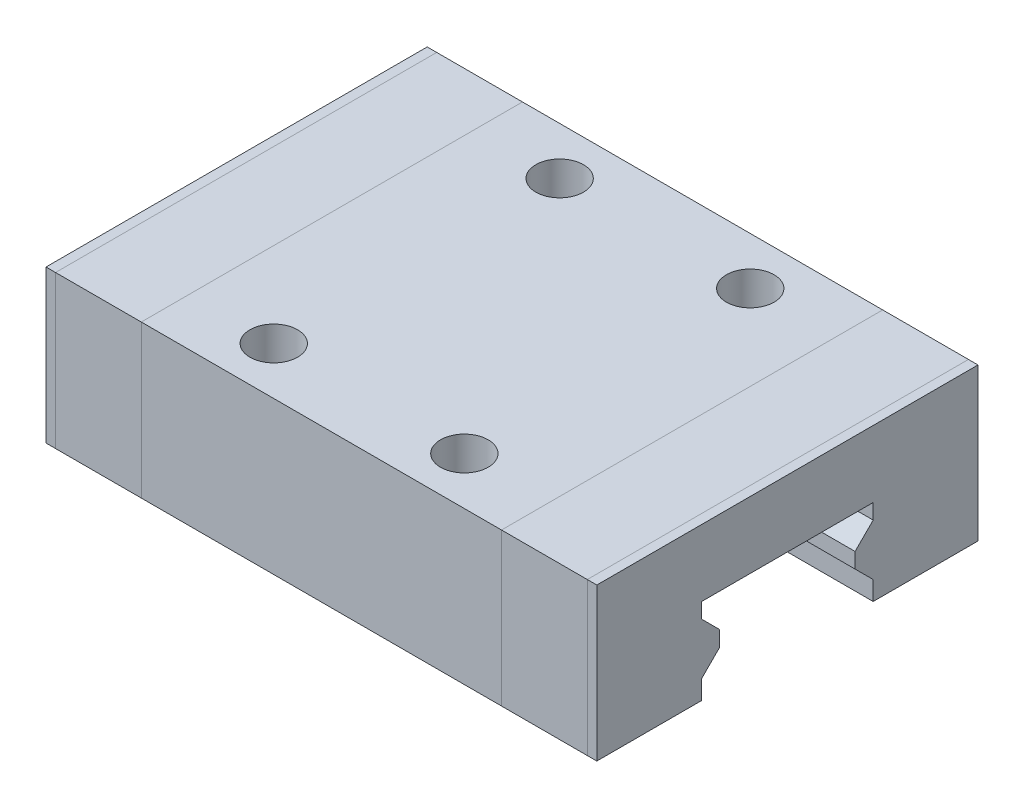
ISO-10303-21;
HEADER;
FILE_DESCRIPTION(('STEP AP214'),'2;1');
FILE_NAME('part.step','',(''),(''),'','','');
FILE_SCHEMA(('AUTOMOTIVE_DESIGN { 1 0 10303 214 1 1 1 1 }'));
ENDSEC;
DATA;
#1=APPLICATION_CONTEXT('core data for automotive mechanical design processes');
#2=APPLICATION_PROTOCOL_DEFINITION('international standard','automotive_design',2000,#1);
#3=PRODUCT_CONTEXT('',#1,'mechanical');
#4=PRODUCT('Part','Part','',(#3));
#5=PRODUCT_RELATED_PRODUCT_CATEGORY('part','',(#4));
#6=PRODUCT_DEFINITION_FORMATION('','',#4);
#7=PRODUCT_DEFINITION_CONTEXT('part definition',#1,'design');
#8=PRODUCT_DEFINITION('design','',#6,#7);
#9=PRODUCT_DEFINITION_SHAPE('','',#8);
#10=(LENGTH_UNIT() NAMED_UNIT(*) SI_UNIT(.MILLI.,.METRE.));
#11=(NAMED_UNIT(*) PLANE_ANGLE_UNIT() SI_UNIT($,.RADIAN.));
#12=(NAMED_UNIT(*) SI_UNIT($,.STERADIAN.) SOLID_ANGLE_UNIT());
#13=UNCERTAINTY_MEASURE_WITH_UNIT(LENGTH_MEASURE(1.E-05),#10,'distance_accuracy_value','');
#14=(GEOMETRIC_REPRESENTATION_CONTEXT(3) GLOBAL_UNCERTAINTY_ASSIGNED_CONTEXT((#13)) GLOBAL_UNIT_ASSIGNED_CONTEXT((#10,
#11,#12)) REPRESENTATION_CONTEXT('',''));
#15=CARTESIAN_POINT('',(0.,0.,0.));
#16=DIRECTION('',(0.,0.,1.));
#17=DIRECTION('',(1.,0.,0.));
#18=AXIS2_PLACEMENT_3D('',#15,#16,#17);
#19=CARTESIAN_POINT('',(0.,0.,0.));
#20=DIRECTION('',(0.,1.,0.));
#21=DIRECTION('',(0.,0.,1.));
#22=AXIS2_PLACEMENT_3D('',#19,#20,#21);
#23=PLANE('',#22);
#24=DIRECTION('',(0.,0.,-1.));
#25=VECTOR('',#24,1.);
#26=CARTESIAN_POINT('',(13.95,0.,0.));
#27=LINE('',#26,#25);
#28=CARTESIAN_POINT('',(13.95,0.,-4.5));
#29=VERTEX_POINT('',#28);
#30=CARTESIAN_POINT('',(13.95,0.,-10.));
#31=VERTEX_POINT('',#30);
#32=EDGE_CURVE('E453',#29,#31,#27,.T.);
#33=ORIENTED_EDGE('',*,*,#32,.F.);
#34=DIRECTION('',(-1.,0.,0.));
#35=VECTOR('',#34,1.);
#36=CARTESIAN_POINT('',(14.45,0.,-4.5));
#37=LINE('',#36,#35);
#38=CARTESIAN_POINT('',(9.45,0.,-4.5));
#39=VERTEX_POINT('',#38);
#40=EDGE_CURVE('E339',#29,#39,#37,.T.);
#41=ORIENTED_EDGE('',*,*,#40,.T.);
#42=DIRECTION('',(0.,0.,1.));
#43=VECTOR('',#42,1.);
#44=CARTESIAN_POINT('',(9.45,0.,0.));
#45=LINE('',#44,#43);
#46=CARTESIAN_POINT('',(9.45,0.,-10.));
#47=VERTEX_POINT('',#46);
#48=EDGE_CURVE('E441',#47,#39,#45,.T.);
#49=ORIENTED_EDGE('',*,*,#48,.F.);
#50=DIRECTION('',(-1.,0.,0.));
#51=VECTOR('',#50,1.);
#52=CARTESIAN_POINT('',(14.45,0.,-10.));
#53=LINE('',#52,#51);
#54=EDGE_CURVE('E398',#31,#47,#53,.T.);
#55=ORIENTED_EDGE('',*,*,#54,.F.);
#56=EDGE_LOOP('',(#33,#41,#49,#55));
#57=FACE_BOUND('',#56,.T.);
#58=ADVANCED_FACE('F40',(#57),#23,.F.);
#59=DIRECTION('',(0.,0.,-1.));
#60=VECTOR('',#59,1.);
#61=CARTESIAN_POINT('',(-13.95,0.,0.));
#62=LINE('',#61,#60);
#63=CARTESIAN_POINT('',(-13.95,0.,-4.5));
#64=VERTEX_POINT('',#63);
#65=CARTESIAN_POINT('',(-13.95,0.,-10.));
#66=VERTEX_POINT('',#65);
#67=EDGE_CURVE('E449',#64,#66,#62,.T.);
#68=ORIENTED_EDGE('',*,*,#67,.F.);
#69=CARTESIAN_POINT('',(-14.45,0.,-4.5));
#70=VERTEX_POINT('',#69);
#71=EDGE_CURVE('E340',#64,#70,#37,.T.);
#72=ORIENTED_EDGE('',*,*,#71,.T.);
#73=DIRECTION('',(0.,0.,1.));
#74=VECTOR('',#73,1.);
#75=CARTESIAN_POINT('',(-14.45,0.,10.));
#76=LINE('',#75,#74);
#77=CARTESIAN_POINT('',(-14.45,0.,-10.));
#78=VERTEX_POINT('',#77);
#79=EDGE_CURVE('E382',#78,#70,#76,.T.);
#80=ORIENTED_EDGE('',*,*,#79,.F.);
#81=EDGE_CURVE('E395',#66,#78,#53,.T.);
#82=ORIENTED_EDGE('',*,*,#81,.F.);
#83=EDGE_LOOP('',(#68,#72,#80,#82));
#84=FACE_BOUND('',#83,.T.);
#85=ADVANCED_FACE('F535',(#84),#23,.F.);
#86=DIRECTION('',(0.,0.,-1.));
#87=VECTOR('',#86,1.);
#88=CARTESIAN_POINT('',(14.45,0.,10.));
#89=LINE('',#88,#87);
#90=CARTESIAN_POINT('',(14.45,0.,-4.5));
#91=VERTEX_POINT('',#90);
#92=CARTESIAN_POINT('',(14.45,0.,-10.));
#93=VERTEX_POINT('',#92);
#94=EDGE_CURVE('E389',#91,#93,#89,.T.);
#95=ORIENTED_EDGE('',*,*,#94,.F.);
#96=EDGE_CURVE('E335',#91,#29,#37,.T.);
#97=ORIENTED_EDGE('',*,*,#96,.T.);
#98=ORIENTED_EDGE('',*,*,#32,.T.);
#99=EDGE_CURVE('E367',#93,#31,#53,.T.);
#100=ORIENTED_EDGE('',*,*,#99,.F.);
#101=EDGE_LOOP('',(#95,#97,#98,#100));
#102=FACE_BOUND('',#101,.T.);
#103=ADVANCED_FACE('F505',(#102),#23,.F.);
#104=DIRECTION('',(0.,0.,-1.));
#105=VECTOR('',#104,1.);
#106=CARTESIAN_POINT('',(-9.45,0.,0.));
#107=LINE('',#106,#105);
#108=CARTESIAN_POINT('',(-9.45,0.,-4.5));
#109=VERTEX_POINT('',#108);
#110=CARTESIAN_POINT('',(-9.45,0.,-10.));
#111=VERTEX_POINT('',#110);
#112=EDGE_CURVE('E416',#109,#111,#107,.T.);
#113=ORIENTED_EDGE('',*,*,#112,.F.);
#114=EDGE_CURVE('E527',#109,#64,#37,.T.);
#115=ORIENTED_EDGE('',*,*,#114,.T.);
#116=ORIENTED_EDGE('',*,*,#67,.T.);
#117=EDGE_CURVE('E399',#111,#66,#53,.T.);
#118=ORIENTED_EDGE('',*,*,#117,.F.);
#119=EDGE_LOOP('',(#113,#115,#116,#118));
#120=FACE_BOUND('',#119,.T.);
#121=ADVANCED_FACE('F559',(#120),#23,.F.);
#122=ORIENTED_EDGE('',*,*,#48,.T.);
#123=DIRECTION('',(-1.,0.,0.));
#124=VECTOR('',#123,1.);
#125=CARTESIAN_POINT('',(0.,0.,-4.5));
#126=LINE('',#125,#124);
#127=EDGE_CURVE('E11',#39,#109,#126,.T.);
#128=ORIENTED_EDGE('',*,*,#127,.T.);
#129=ORIENTED_EDGE('',*,*,#112,.T.);
#130=EDGE_CURVE('E517',#47,#111,#53,.T.);
#131=ORIENTED_EDGE('',*,*,#130,.F.);
#132=EDGE_LOOP('',(#122,#128,#129,#131));
#133=FACE_BOUND('',#132,.T.);
#134=ADVANCED_FACE('F560',(#133),#23,.F.);
#135=CARTESIAN_POINT('',(14.45,8.,10.));
#136=DIRECTION('',(0.,0.,-1.));
#137=DIRECTION('',(-1.,0.,0.));
#138=AXIS2_PLACEMENT_3D('',#135,#136,#137);
#139=PLANE('',#138);
#140=DIRECTION('',(0.,-1.,0.));
#141=VECTOR('',#140,1.);
#142=CARTESIAN_POINT('',(13.95,8.,10.));
#143=LINE('',#142,#141);
#144=CARTESIAN_POINT('',(13.95,8.,10.));
#145=VERTEX_POINT('',#144);
#146=CARTESIAN_POINT('',(13.95,0.,10.));
#147=VERTEX_POINT('',#146);
#148=EDGE_CURVE('E63',#145,#147,#143,.T.);
#149=ORIENTED_EDGE('',*,*,#148,.F.);
#150=DIRECTION('',(1.,0.,0.));
#151=VECTOR('',#150,1.);
#152=CARTESIAN_POINT('',(14.45,8.,10.));
#153=LINE('',#152,#151);
#154=CARTESIAN_POINT('',(9.45,8.,10.));
#155=VERTEX_POINT('',#154);
#156=EDGE_CURVE('E639',#155,#145,#153,.T.);
#157=ORIENTED_EDGE('',*,*,#156,.F.);
#158=DIRECTION('',(0.,1.,0.));
#159=VECTOR('',#158,1.);
#160=CARTESIAN_POINT('',(9.45,8.,10.));
#161=LINE('',#160,#159);
#162=CARTESIAN_POINT('',(9.45,0.,10.));
#163=VERTEX_POINT('',#162);
#164=EDGE_CURVE('E433',#163,#155,#161,.T.);
#165=ORIENTED_EDGE('',*,*,#164,.F.);
#166=DIRECTION('',(1.,0.,0.));
#167=VECTOR('',#166,1.);
#168=CARTESIAN_POINT('',(14.45,0.,10.));
#169=LINE('',#168,#167);
#170=EDGE_CURVE('E484',#163,#147,#169,.T.);
#171=ORIENTED_EDGE('',*,*,#170,.T.);
#172=EDGE_LOOP('',(#149,#157,#165,#171));
#173=FACE_BOUND('',#172,.T.);
#174=ADVANCED_FACE('F562',(#173),#139,.F.);
#175=CARTESIAN_POINT('',(14.45,8.,-10.));
#176=DIRECTION('',(0.,0.,1.));
#177=DIRECTION('',(1.,0.,0.));
#178=AXIS2_PLACEMENT_3D('',#175,#176,#177);
#179=PLANE('',#178);
#180=DIRECTION('',(0.,1.,0.));
#181=VECTOR('',#180,1.);
#182=CARTESIAN_POINT('',(13.95,8.,-10.));
#183=LINE('',#182,#181);
#184=CARTESIAN_POINT('',(13.95,8.,-10.));
#185=VERTEX_POINT('',#184);
#186=EDGE_CURVE('E461',#31,#185,#183,.T.);
#187=ORIENTED_EDGE('',*,*,#186,.F.);
#188=ORIENTED_EDGE('',*,*,#54,.T.);
#189=DIRECTION('',(0.,-1.,0.));
#190=VECTOR('',#189,1.);
#191=CARTESIAN_POINT('',(9.45,8.,-10.));
#192=LINE('',#191,#190);
#193=CARTESIAN_POINT('',(9.45,8.,-10.));
#194=VERTEX_POINT('',#193);
#195=EDGE_CURVE('E429',#194,#47,#192,.T.);
#196=ORIENTED_EDGE('',*,*,#195,.F.);
#197=DIRECTION('',(-1.,0.,0.));
#198=VECTOR('',#197,1.);
#199=CARTESIAN_POINT('',(14.45,8.,-10.));
#200=LINE('',#199,#198);
#201=EDGE_CURVE('E380',#185,#194,#200,.T.);
#202=ORIENTED_EDGE('',*,*,#201,.F.);
#203=EDGE_LOOP('',(#187,#188,#196,#202));
#204=FACE_BOUND('',#203,.T.);
#205=ADVANCED_FACE('F511',(#204),#179,.F.);
#206=CARTESIAN_POINT('',(0.,8.,0.));
#207=DIRECTION('',(0.,1.,0.));
#208=DIRECTION('',(0.,0.,1.));
#209=AXIS2_PLACEMENT_3D('',#206,#207,#208);
#210=PLANE('',#209);
#211=ORIENTED_EDGE('',*,*,#156,.T.);
#212=DIRECTION('',(0.,0.,-1.));
#213=VECTOR('',#212,1.);
#214=CARTESIAN_POINT('',(13.95,8.,0.));
#215=LINE('',#214,#213);
#216=EDGE_CURVE('E464',#145,#185,#215,.T.);
#217=ORIENTED_EDGE('',*,*,#216,.T.);
#218=ORIENTED_EDGE('',*,*,#201,.T.);
#219=DIRECTION('',(0.,0.,1.));
#220=VECTOR('',#219,1.);
#221=CARTESIAN_POINT('',(9.45,8.,0.));
#222=LINE('',#221,#220);
#223=EDGE_CURVE('E434',#194,#155,#222,.T.);
#224=ORIENTED_EDGE('',*,*,#223,.T.);
#225=EDGE_LOOP('',(#211,#217,#218,#224));
#226=FACE_BOUND('',#225,.T.);
#227=ADVANCED_FACE('F573',(#226),#210,.T.);
#228=CARTESIAN_POINT('',(9.45,0.,4.5));
#229=VERTEX_POINT('',#228);
#230=EDGE_CURVE('E421',#229,#163,#45,.T.);
#231=ORIENTED_EDGE('',*,*,#230,.F.);
#232=DIRECTION('',(-1.,0.,0.));
#233=VECTOR('',#232,1.);
#234=CARTESIAN_POINT('',(14.45,0.,4.5));
#235=LINE('',#234,#233);
#236=CARTESIAN_POINT('',(13.95,0.,4.5));
#237=VERTEX_POINT('',#236);
#238=EDGE_CURVE('E55',#237,#229,#235,.T.);
#239=ORIENTED_EDGE('',*,*,#238,.F.);
#240=EDGE_CURVE('E470',#147,#237,#27,.T.);
#241=ORIENTED_EDGE('',*,*,#240,.F.);
#242=ORIENTED_EDGE('',*,*,#170,.F.);
#243=EDGE_LOOP('',(#231,#239,#241,#242));
#244=FACE_BOUND('',#243,.T.);
#245=ADVANCED_FACE('F482',(#244),#23,.F.);
#246=DIRECTION('',(0.,1.,0.));
#247=VECTOR('',#246,1.);
#248=CARTESIAN_POINT('',(-13.95,8.,-10.));
#249=LINE('',#248,#247);
#250=CARTESIAN_POINT('',(-13.95,8.,-10.));
#251=VERTEX_POINT('',#250);
#252=EDGE_CURVE('E450',#66,#251,#249,.T.);
#253=ORIENTED_EDGE('',*,*,#252,.F.);
#254=ORIENTED_EDGE('',*,*,#81,.T.);
#255=DIRECTION('',(0.,-1.,0.));
#256=VECTOR('',#255,1.);
#257=CARTESIAN_POINT('',(-14.45,8.,-10.));
#258=LINE('',#257,#256);
#259=CARTESIAN_POINT('',(-14.45,8.,-10.));
#260=VERTEX_POINT('',#259);
#261=EDGE_CURVE('E379',#260,#78,#258,.T.);
#262=ORIENTED_EDGE('',*,*,#261,.F.);
#263=EDGE_CURVE('E375',#251,#260,#200,.T.);
#264=ORIENTED_EDGE('',*,*,#263,.F.);
#265=EDGE_LOOP('',(#253,#254,#262,#264));
#266=FACE_BOUND('',#265,.T.);
#267=ADVANCED_FACE('F546',(#266),#179,.F.);
#268=CARTESIAN_POINT('',(-14.45,0.,4.5));
#269=VERTEX_POINT('',#268);
#270=CARTESIAN_POINT('',(-14.45,0.,10.));
#271=VERTEX_POINT('',#270);
#272=EDGE_CURVE('E338',#269,#271,#76,.T.);
#273=ORIENTED_EDGE('',*,*,#272,.F.);
#274=CARTESIAN_POINT('',(-13.95,0.,4.5));
#275=VERTEX_POINT('',#274);
#276=EDGE_CURVE('E304',#275,#269,#235,.T.);
#277=ORIENTED_EDGE('',*,*,#276,.F.);
#278=CARTESIAN_POINT('',(-13.95,0.,10.));
#279=VERTEX_POINT('',#278);
#280=EDGE_CURVE('E454',#279,#275,#62,.T.);
#281=ORIENTED_EDGE('',*,*,#280,.F.);
#282=EDGE_CURVE('E386',#271,#279,#169,.T.);
#283=ORIENTED_EDGE('',*,*,#282,.F.);
#284=EDGE_LOOP('',(#273,#277,#281,#283));
#285=FACE_BOUND('',#284,.T.);
#286=ADVANCED_FACE('F574',(#285),#23,.F.);
#287=DIRECTION('',(0.,-1.,0.));
#288=VECTOR('',#287,1.);
#289=CARTESIAN_POINT('',(-13.95,8.,10.));
#290=LINE('',#289,#288);
#291=CARTESIAN_POINT('',(-13.95,8.,10.));
#292=VERTEX_POINT('',#291);
#293=EDGE_CURVE('E445',#292,#279,#290,.T.);
#294=ORIENTED_EDGE('',*,*,#293,.F.);
#295=CARTESIAN_POINT('',(-14.45,8.,10.));
#296=VERTEX_POINT('',#295);
#297=EDGE_CURVE('E368',#296,#292,#153,.T.);
#298=ORIENTED_EDGE('',*,*,#297,.F.);
#299=DIRECTION('',(0.,-1.,0.));
#300=VECTOR('',#299,1.);
#301=CARTESIAN_POINT('',(-14.45,8.,10.));
#302=LINE('',#301,#300);
#303=EDGE_CURVE('E408',#296,#271,#302,.T.);
#304=ORIENTED_EDGE('',*,*,#303,.T.);
#305=ORIENTED_EDGE('',*,*,#282,.T.);
#306=EDGE_LOOP('',(#294,#298,#304,#305));
#307=FACE_BOUND('',#306,.T.);
#308=ADVANCED_FACE('F568',(#307),#139,.F.);
#309=ORIENTED_EDGE('',*,*,#297,.T.);
#310=DIRECTION('',(0.,0.,-1.));
#311=VECTOR('',#310,1.);
#312=CARTESIAN_POINT('',(-13.95,8.,0.));
#313=LINE('',#312,#311);
#314=EDGE_CURVE('E437',#292,#251,#313,.T.);
#315=ORIENTED_EDGE('',*,*,#314,.T.);
#316=ORIENTED_EDGE('',*,*,#263,.T.);
#317=DIRECTION('',(0.,0.,1.));
#318=VECTOR('',#317,1.);
#319=CARTESIAN_POINT('',(-14.45,8.,10.));
#320=LINE('',#319,#318);
#321=EDGE_CURVE('E363',#260,#296,#320,.T.);
#322=ORIENTED_EDGE('',*,*,#321,.T.);
#323=EDGE_LOOP('',(#309,#315,#316,#322));
#324=FACE_BOUND('',#323,.T.);
#325=ADVANCED_FACE('F607',(#324),#210,.T.);
#326=CARTESIAN_POINT('',(14.45,8.,10.));
#327=VERTEX_POINT('',#326);
#328=EDGE_CURVE('E366',#145,#327,#153,.T.);
#329=ORIENTED_EDGE('',*,*,#328,.F.);
#330=ORIENTED_EDGE('',*,*,#148,.T.);
#331=CARTESIAN_POINT('',(14.45,0.,10.));
#332=VERTEX_POINT('',#331);
#333=EDGE_CURVE('E385',#147,#332,#169,.T.);
#334=ORIENTED_EDGE('',*,*,#333,.T.);
#335=DIRECTION('',(0.,-1.,0.));
#336=VECTOR('',#335,1.);
#337=CARTESIAN_POINT('',(14.45,8.,10.));
#338=LINE('',#337,#336);
#339=EDGE_CURVE('E405',#327,#332,#338,.T.);
#340=ORIENTED_EDGE('',*,*,#339,.F.);
#341=EDGE_LOOP('',(#329,#330,#334,#340));
#342=FACE_BOUND('',#341,.T.);
#343=ADVANCED_FACE('F599',(#342),#139,.F.);
#344=ORIENTED_EDGE('',*,*,#99,.T.);
#345=ORIENTED_EDGE('',*,*,#186,.T.);
#346=CARTESIAN_POINT('',(14.45,8.,-10.));
#347=VERTEX_POINT('',#346);
#348=EDGE_CURVE('E376',#347,#185,#200,.T.);
#349=ORIENTED_EDGE('',*,*,#348,.F.);
#350=DIRECTION('',(0.,-1.,0.));
#351=VECTOR('',#350,1.);
#352=CARTESIAN_POINT('',(14.45,8.,-10.));
#353=LINE('',#352,#351);
#354=EDGE_CURVE('E402',#347,#93,#353,.T.);
#355=ORIENTED_EDGE('',*,*,#354,.T.);
#356=EDGE_LOOP('',(#344,#345,#349,#355));
#357=FACE_BOUND('',#356,.T.);
#358=ADVANCED_FACE('F518',(#357),#179,.F.);
#359=ORIENTED_EDGE('',*,*,#216,.F.);
#360=ORIENTED_EDGE('',*,*,#328,.T.);
#361=DIRECTION('',(0.,0.,-1.));
#362=VECTOR('',#361,1.);
#363=CARTESIAN_POINT('',(14.45,8.,10.));
#364=LINE('',#363,#362);
#365=EDGE_CURVE('E371',#327,#347,#364,.T.);
#366=ORIENTED_EDGE('',*,*,#365,.T.);
#367=ORIENTED_EDGE('',*,*,#348,.T.);
#368=EDGE_LOOP('',(#359,#360,#366,#367));
#369=FACE_BOUND('',#368,.T.);
#370=ADVANCED_FACE('F601',(#369),#210,.T.);
#371=ORIENTED_EDGE('',*,*,#240,.T.);
#372=CARTESIAN_POINT('',(14.45,0.,4.5));
#373=VERTEX_POINT('',#372);
#374=EDGE_CURVE('E361',#373,#237,#235,.T.);
#375=ORIENTED_EDGE('',*,*,#374,.F.);
#376=EDGE_CURVE('E392',#332,#373,#89,.T.);
#377=ORIENTED_EDGE('',*,*,#376,.F.);
#378=ORIENTED_EDGE('',*,*,#333,.F.);
#379=EDGE_LOOP('',(#371,#375,#377,#378));
#380=FACE_BOUND('',#379,.T.);
#381=ADVANCED_FACE('F593',(#380),#23,.F.);
#382=ORIENTED_EDGE('',*,*,#117,.T.);
#383=ORIENTED_EDGE('',*,*,#252,.T.);
#384=CARTESIAN_POINT('',(-9.45,8.,-10.));
#385=VERTEX_POINT('',#384);
#386=EDGE_CURVE('E381',#385,#251,#200,.T.);
#387=ORIENTED_EDGE('',*,*,#386,.F.);
#388=DIRECTION('',(0.,1.,0.));
#389=VECTOR('',#388,1.);
#390=CARTESIAN_POINT('',(-9.45,8.,-10.));
#391=LINE('',#390,#389);
#392=EDGE_CURVE('E417',#111,#385,#391,.T.);
#393=ORIENTED_EDGE('',*,*,#392,.F.);
#394=EDGE_LOOP('',(#382,#383,#387,#393));
#395=FACE_BOUND('',#394,.T.);
#396=ADVANCED_FACE('F558',(#395),#179,.F.);
#397=ORIENTED_EDGE('',*,*,#280,.T.);
#398=CARTESIAN_POINT('',(-9.45,0.,4.5));
#399=VERTEX_POINT('',#398);
#400=EDGE_CURVE('E623',#399,#275,#235,.T.);
#401=ORIENTED_EDGE('',*,*,#400,.F.);
#402=CARTESIAN_POINT('',(-9.45,0.,10.));
#403=VERTEX_POINT('',#402);
#404=EDGE_CURVE('E422',#403,#399,#107,.T.);
#405=ORIENTED_EDGE('',*,*,#404,.F.);
#406=EDGE_CURVE('E390',#279,#403,#169,.T.);
#407=ORIENTED_EDGE('',*,*,#406,.F.);
#408=EDGE_LOOP('',(#397,#401,#405,#407));
#409=FACE_BOUND('',#408,.T.);
#410=ADVANCED_FACE('F581',(#409),#23,.F.);
#411=CARTESIAN_POINT('',(-9.45,8.,10.));
#412=VERTEX_POINT('',#411);
#413=EDGE_CURVE('E372',#292,#412,#153,.T.);
#414=ORIENTED_EDGE('',*,*,#413,.F.);
#415=ORIENTED_EDGE('',*,*,#293,.T.);
#416=ORIENTED_EDGE('',*,*,#406,.T.);
#417=DIRECTION('',(0.,-1.,0.));
#418=VECTOR('',#417,1.);
#419=CARTESIAN_POINT('',(-9.45,8.,10.));
#420=LINE('',#419,#418);
#421=EDGE_CURVE('E412',#412,#403,#420,.T.);
#422=ORIENTED_EDGE('',*,*,#421,.F.);
#423=EDGE_LOOP('',(#414,#415,#416,#422));
#424=FACE_BOUND('',#423,.T.);
#425=ADVANCED_FACE('F591',(#424),#139,.F.);
#426=ORIENTED_EDGE('',*,*,#314,.F.);
#427=ORIENTED_EDGE('',*,*,#413,.T.);
#428=DIRECTION('',(0.,0.,-1.));
#429=VECTOR('',#428,1.);
#430=CARTESIAN_POINT('',(-9.45,8.,0.));
#431=LINE('',#430,#429);
#432=EDGE_CURVE('E411',#412,#385,#431,.T.);
#433=ORIENTED_EDGE('',*,*,#432,.T.);
#434=ORIENTED_EDGE('',*,*,#386,.T.);
#435=EDGE_LOOP('',(#426,#427,#433,#434));
#436=FACE_BOUND('',#435,.T.);
#437=ADVANCED_FACE('F589',(#436),#210,.T.);
#438=CARTESIAN_POINT('',(-14.45,8.,10.));
#439=DIRECTION('',(1.,0.,0.));
#440=DIRECTION('',(0.,0.,-1.));
#441=AXIS2_PLACEMENT_3D('',#438,#439,#440);
#442=PLANE('',#441);
#443=ORIENTED_EDGE('',*,*,#79,.T.);
#444=DIRECTION('',(0.,-1.,0.));
#445=VECTOR('',#444,1.);
#446=CARTESIAN_POINT('',(-14.45,0.,-4.5));
#447=LINE('',#446,#445);
#448=CARTESIAN_POINT('',(-14.45,1.,-4.5));
#449=VERTEX_POINT('',#448);
#450=EDGE_CURVE('E274',#449,#70,#447,.T.);
#451=ORIENTED_EDGE('',*,*,#450,.F.);
#452=DIRECTION('',(0.,-0.707106781186547,-0.707106781186548));
#453=VECTOR('',#452,1.);
#454=CARTESIAN_POINT('',(-14.45,1.,-4.5));
#455=LINE('',#454,#453);
#456=CARTESIAN_POINT('',(-14.45,1.95,-3.55));
#457=VERTEX_POINT('',#456);
#458=EDGE_CURVE('E331',#457,#449,#455,.T.);
#459=ORIENTED_EDGE('',*,*,#458,.F.);
#460=DIRECTION('',(0.,-1.,0.));
#461=VECTOR('',#460,1.);
#462=CARTESIAN_POINT('',(-14.45,2.75,-3.55));
#463=LINE('',#462,#461);
#464=CARTESIAN_POINT('',(-14.45,2.75,-3.55));
#465=VERTEX_POINT('',#464);
#466=EDGE_CURVE('E328',#465,#457,#463,.T.);
#467=ORIENTED_EDGE('',*,*,#466,.F.);
#468=DIRECTION('',(0.,-0.707106781186547,0.707106781186547));
#469=VECTOR('',#468,1.);
#470=CARTESIAN_POINT('',(-14.45,2.75,-3.55));
#471=LINE('',#470,#469);
#472=CARTESIAN_POINT('',(-14.45,3.7,-4.5));
#473=VERTEX_POINT('',#472);
#474=EDGE_CURVE('E325',#473,#465,#471,.T.);
#475=ORIENTED_EDGE('',*,*,#474,.F.);
#476=DIRECTION('',(0.,-1.,0.));
#477=VECTOR('',#476,1.);
#478=CARTESIAN_POINT('',(-14.45,3.7,-4.5));
#479=LINE('',#478,#477);
#480=CARTESIAN_POINT('',(-14.45,4.5,-4.5));
#481=VERTEX_POINT('',#480);
#482=EDGE_CURVE('E322',#481,#473,#479,.T.);
#483=ORIENTED_EDGE('',*,*,#482,.F.);
#484=DIRECTION('',(0.,0.,-1.));
#485=VECTOR('',#484,1.);
#486=CARTESIAN_POINT('',(-14.45,4.5,-4.5));
#487=LINE('',#486,#485);
#488=CARTESIAN_POINT('',(-14.45,4.5,4.5));
#489=VERTEX_POINT('',#488);
#490=EDGE_CURVE('E319',#489,#481,#487,.T.);
#491=ORIENTED_EDGE('',*,*,#490,.F.);
#492=DIRECTION('',(0.,1.,0.));
#493=VECTOR('',#492,1.);
#494=CARTESIAN_POINT('',(-14.45,3.7,4.5));
#495=LINE('',#494,#493);
#496=CARTESIAN_POINT('',(-14.45,3.7,4.5));
#497=VERTEX_POINT('',#496);
#498=EDGE_CURVE('E316',#497,#489,#495,.T.);
#499=ORIENTED_EDGE('',*,*,#498,.F.);
#500=DIRECTION('',(0.,0.707106781186547,0.707106781186547));
#501=VECTOR('',#500,1.);
#502=CARTESIAN_POINT('',(-14.45,2.75,3.55));
#503=LINE('',#502,#501);
#504=CARTESIAN_POINT('',(-14.45,2.75,3.55));
#505=VERTEX_POINT('',#504);
#506=EDGE_CURVE('E313',#505,#497,#503,.T.);
#507=ORIENTED_EDGE('',*,*,#506,.F.);
#508=DIRECTION('',(0.,1.,0.));
#509=VECTOR('',#508,1.);
#510=CARTESIAN_POINT('',(-14.45,2.75,3.55));
#511=LINE('',#510,#509);
#512=CARTESIAN_POINT('',(-14.45,1.95,3.55));
#513=VERTEX_POINT('',#512);
#514=EDGE_CURVE('E310',#513,#505,#511,.T.);
#515=ORIENTED_EDGE('',*,*,#514,.F.);
#516=DIRECTION('',(0.,0.707106781186547,-0.707106781186548));
#517=VECTOR('',#516,1.);
#518=CARTESIAN_POINT('',(-14.45,1.,4.5));
#519=LINE('',#518,#517);
#520=CARTESIAN_POINT('',(-14.45,1.,4.5));
#521=VERTEX_POINT('',#520);
#522=EDGE_CURVE('E307',#521,#513,#519,.T.);
#523=ORIENTED_EDGE('',*,*,#522,.F.);
#524=DIRECTION('',(0.,1.,0.));
#525=VECTOR('',#524,1.);
#526=CARTESIAN_POINT('',(-14.45,0.,4.5));
#527=LINE('',#526,#525);
#528=EDGE_CURVE('E269',#269,#521,#527,.T.);
#529=ORIENTED_EDGE('',*,*,#528,.F.);
#530=ORIENTED_EDGE('',*,*,#272,.T.);
#531=ORIENTED_EDGE('',*,*,#303,.F.);
#532=ORIENTED_EDGE('',*,*,#321,.F.);
#533=ORIENTED_EDGE('',*,*,#261,.T.);
#534=EDGE_LOOP('',(#443,#451,#459,#467,#475,#483,#491,#499,#507,#515,#523,#529,#530,#531,#532,#533));
#535=FACE_BOUND('',#534,.T.);
#536=ADVANCED_FACE('F42',(#535),#442,.F.);
#537=EDGE_CURVE('E391',#403,#163,#169,.T.);
#538=ORIENTED_EDGE('',*,*,#537,.T.);
#539=ORIENTED_EDGE('',*,*,#164,.T.);
#540=EDGE_CURVE('E373',#412,#155,#153,.T.);
#541=ORIENTED_EDGE('',*,*,#540,.F.);
#542=ORIENTED_EDGE('',*,*,#421,.T.);
#543=EDGE_LOOP('',(#538,#539,#541,#542));
#544=FACE_BOUND('',#543,.T.);
#545=ADVANCED_FACE('F569',(#544),#139,.F.);
#546=CARTESIAN_POINT('',(14.45,8.,10.));
#547=DIRECTION('',(-1.,0.,0.));
#548=DIRECTION('',(0.,0.,1.));
#549=AXIS2_PLACEMENT_3D('',#546,#547,#548);
#550=PLANE('',#549);
#551=DIRECTION('',(0.,-0.707106781186547,-0.707106781186548));
#552=VECTOR('',#551,1.);
#553=CARTESIAN_POINT('',(14.45,1.,-4.5));
#554=LINE('',#553,#552);
#555=CARTESIAN_POINT('',(14.45,1.95,-3.55));
#556=VERTEX_POINT('',#555);
#557=CARTESIAN_POINT('',(14.45,1.,-4.5));
#558=VERTEX_POINT('',#557);
#559=EDGE_CURVE('E298',#556,#558,#554,.T.);
#560=ORIENTED_EDGE('',*,*,#559,.T.);
#561=DIRECTION('',(0.,-1.,0.));
#562=VECTOR('',#561,1.);
#563=CARTESIAN_POINT('',(14.45,0.,-4.5));
#564=LINE('',#563,#562);
#565=EDGE_CURVE('E301',#558,#91,#564,.T.);
#566=ORIENTED_EDGE('',*,*,#565,.T.);
#567=ORIENTED_EDGE('',*,*,#94,.T.);
#568=ORIENTED_EDGE('',*,*,#354,.F.);
#569=ORIENTED_EDGE('',*,*,#365,.F.);
#570=ORIENTED_EDGE('',*,*,#339,.T.);
#571=ORIENTED_EDGE('',*,*,#376,.T.);
#572=DIRECTION('',(0.,1.,0.));
#573=VECTOR('',#572,1.);
#574=CARTESIAN_POINT('',(14.45,0.,4.5));
#575=LINE('',#574,#573);
#576=CARTESIAN_POINT('',(14.45,1.,4.5));
#577=VERTEX_POINT('',#576);
#578=EDGE_CURVE('E270',#373,#577,#575,.T.);
#579=ORIENTED_EDGE('',*,*,#578,.T.);
#580=DIRECTION('',(0.,0.707106781186547,-0.707106781186548));
#581=VECTOR('',#580,1.);
#582=CARTESIAN_POINT('',(14.45,1.,4.5));
#583=LINE('',#582,#581);
#584=CARTESIAN_POINT('',(14.45,1.95,3.55));
#585=VERTEX_POINT('',#584);
#586=EDGE_CURVE('E273',#577,#585,#583,.T.);
#587=ORIENTED_EDGE('',*,*,#586,.T.);
#588=DIRECTION('',(0.,1.,0.));
#589=VECTOR('',#588,1.);
#590=CARTESIAN_POINT('',(14.45,2.75,3.55));
#591=LINE('',#590,#589);
#592=CARTESIAN_POINT('',(14.45,2.75,3.55));
#593=VERTEX_POINT('',#592);
#594=EDGE_CURVE('E277',#585,#593,#591,.T.);
#595=ORIENTED_EDGE('',*,*,#594,.T.);
#596=DIRECTION('',(0.,0.707106781186547,0.707106781186547));
#597=VECTOR('',#596,1.);
#598=CARTESIAN_POINT('',(14.45,2.75,3.55));
#599=LINE('',#598,#597);
#600=CARTESIAN_POINT('',(14.45,3.7,4.5));
#601=VERTEX_POINT('',#600);
#602=EDGE_CURVE('E280',#593,#601,#599,.T.);
#603=ORIENTED_EDGE('',*,*,#602,.T.);
#604=DIRECTION('',(0.,1.,0.));
#605=VECTOR('',#604,1.);
#606=CARTESIAN_POINT('',(14.45,3.7,4.5));
#607=LINE('',#606,#605);
#608=CARTESIAN_POINT('',(14.45,4.5,4.5));
#609=VERTEX_POINT('',#608);
#610=EDGE_CURVE('E283',#601,#609,#607,.T.);
#611=ORIENTED_EDGE('',*,*,#610,.T.);
#612=DIRECTION('',(0.,0.,-1.));
#613=VECTOR('',#612,1.);
#614=CARTESIAN_POINT('',(14.45,4.5,-4.5));
#615=LINE('',#614,#613);
#616=CARTESIAN_POINT('',(14.45,4.5,-4.5));
#617=VERTEX_POINT('',#616);
#618=EDGE_CURVE('E286',#609,#617,#615,.T.);
#619=ORIENTED_EDGE('',*,*,#618,.T.);
#620=DIRECTION('',(0.,-1.,0.));
#621=VECTOR('',#620,1.);
#622=CARTESIAN_POINT('',(14.45,3.7,-4.5));
#623=LINE('',#622,#621);
#624=CARTESIAN_POINT('',(14.45,3.7,-4.5));
#625=VERTEX_POINT('',#624);
#626=EDGE_CURVE('E289',#617,#625,#623,.T.);
#627=ORIENTED_EDGE('',*,*,#626,.T.);
#628=DIRECTION('',(0.,-0.707106781186547,0.707106781186547));
#629=VECTOR('',#628,1.);
#630=CARTESIAN_POINT('',(14.45,2.75,-3.55));
#631=LINE('',#630,#629);
#632=CARTESIAN_POINT('',(14.45,2.75,-3.55));
#633=VERTEX_POINT('',#632);
#634=EDGE_CURVE('E292',#625,#633,#631,.T.);
#635=ORIENTED_EDGE('',*,*,#634,.T.);
#636=DIRECTION('',(0.,-1.,0.));
#637=VECTOR('',#636,1.);
#638=CARTESIAN_POINT('',(14.45,2.75,-3.55));
#639=LINE('',#638,#637);
#640=EDGE_CURVE('E295',#633,#556,#639,.T.);
#641=ORIENTED_EDGE('',*,*,#640,.T.);
#642=EDGE_LOOP('',(#560,#566,#567,#568,#569,#570,#571,#579,#587,#595,#603,#611,#619,#627,#635,#641));
#643=FACE_BOUND('',#642,.T.);
#644=ADVANCED_FACE('F522',(#643),#550,.F.);
#645=EDGE_CURVE('E630',#194,#385,#200,.T.);
#646=ORIENTED_EDGE('',*,*,#645,.F.);
#647=ORIENTED_EDGE('',*,*,#195,.T.);
#648=ORIENTED_EDGE('',*,*,#130,.T.);
#649=ORIENTED_EDGE('',*,*,#392,.T.);
#650=EDGE_LOOP('',(#646,#647,#648,#649));
#651=FACE_BOUND('',#650,.T.);
#652=ADVANCED_FACE('F553',(#651),#179,.F.);
#653=CARTESIAN_POINT('',(-5.,8.,7.5));
#654=DIRECTION('',(0.,1.,0.));
#655=DIRECTION('',(0.,0.,1.));
#656=AXIS2_PLACEMENT_3D('',#653,#654,#655);
#657=CIRCLE('',#656,1.25);
#658=CARTESIAN_POINT('',(-5.,8.,8.75));
#659=VERTEX_POINT('',#658);
#660=EDGE_CURVE('E247',#659,#659,#657,.T.);
#661=ORIENTED_EDGE('',*,*,#660,.F.);
#662=EDGE_LOOP('',(#661));
#663=FACE_BOUND('',#662,.T.);
#664=CARTESIAN_POINT('',(5.,8.,7.5));
#665=DIRECTION('',(0.,1.,0.));
#666=DIRECTION('',(0.,0.,1.));
#667=AXIS2_PLACEMENT_3D('',#664,#665,#666);
#668=CIRCLE('',#667,1.25);
#669=CARTESIAN_POINT('',(5.,8.,8.75));
#670=VERTEX_POINT('',#669);
#671=EDGE_CURVE('E246',#670,#670,#668,.T.);
#672=ORIENTED_EDGE('',*,*,#671,.F.);
#673=EDGE_LOOP('',(#672));
#674=FACE_BOUND('',#673,.T.);
#675=CARTESIAN_POINT('',(5.,8.,-7.5));
#676=DIRECTION('',(0.,1.,0.));
#677=DIRECTION('',(0.,0.,1.));
#678=AXIS2_PLACEMENT_3D('',#675,#676,#677);
#679=CIRCLE('',#678,1.25);
#680=CARTESIAN_POINT('',(5.,8.,-6.25));
#681=VERTEX_POINT('',#680);
#682=EDGE_CURVE('E257',#681,#681,#679,.T.);
#683=ORIENTED_EDGE('',*,*,#682,.F.);
#684=EDGE_LOOP('',(#683));
#685=FACE_BOUND('',#684,.T.);
#686=CARTESIAN_POINT('',(-5.,8.,-7.5));
#687=DIRECTION('',(0.,1.,0.));
#688=DIRECTION('',(0.,0.,1.));
#689=AXIS2_PLACEMENT_3D('',#686,#687,#688);
#690=CIRCLE('',#689,1.25);
#691=CARTESIAN_POINT('',(-5.,8.,-6.25));
#692=VERTEX_POINT('',#691);
#693=EDGE_CURVE('E263',#692,#692,#690,.T.);
#694=ORIENTED_EDGE('',*,*,#693,.F.);
#695=EDGE_LOOP('',(#694));
#696=FACE_BOUND('',#695,.T.);
#697=ORIENTED_EDGE('',*,*,#223,.F.);
#698=ORIENTED_EDGE('',*,*,#645,.T.);
#699=ORIENTED_EDGE('',*,*,#432,.F.);
#700=ORIENTED_EDGE('',*,*,#540,.T.);
#701=EDGE_LOOP('',(#697,#698,#699,#700));
#702=FACE_BOUND('',#701,.T.);
#703=ADVANCED_FACE('F580',(#663,#674,#685,#696,#702),#210,.T.);
#704=ORIENTED_EDGE('',*,*,#404,.T.);
#705=DIRECTION('',(1.,0.,0.));
#706=VECTOR('',#705,1.);
#707=CARTESIAN_POINT('',(0.,0.,4.5));
#708=LINE('',#707,#706);
#709=EDGE_CURVE('E48',#399,#229,#708,.T.);
#710=ORIENTED_EDGE('',*,*,#709,.T.);
#711=ORIENTED_EDGE('',*,*,#230,.T.);
#712=ORIENTED_EDGE('',*,*,#537,.F.);
#713=EDGE_LOOP('',(#704,#710,#711,#712));
#714=FACE_BOUND('',#713,.T.);
#715=ADVANCED_FACE('F475',(#714),#23,.F.);
#716=CARTESIAN_POINT('',(14.45,0.,-4.5));
#717=DIRECTION('',(0.,0.,-1.));
#718=DIRECTION('',(-1.,0.,0.));
#719=AXIS2_PLACEMENT_3D('',#716,#717,#718);
#720=PLANE('',#719);
#721=ORIENTED_EDGE('',*,*,#450,.T.);
#722=ORIENTED_EDGE('',*,*,#71,.F.);
#723=ORIENTED_EDGE('',*,*,#114,.F.);
#724=ORIENTED_EDGE('',*,*,#127,.F.);
#725=ORIENTED_EDGE('',*,*,#40,.F.);
#726=ORIENTED_EDGE('',*,*,#96,.F.);
#727=ORIENTED_EDGE('',*,*,#565,.F.);
#728=DIRECTION('',(-1.,0.,0.));
#729=VECTOR('',#728,1.);
#730=CARTESIAN_POINT('',(14.45,1.,-4.5));
#731=LINE('',#730,#729);
#732=EDGE_CURVE('E341',#558,#449,#731,.T.);
#733=ORIENTED_EDGE('',*,*,#732,.T.);
#734=EDGE_LOOP('',(#721,#722,#723,#724,#725,#726,#727,#733));
#735=FACE_BOUND('',#734,.T.);
#736=ADVANCED_FACE('F526',(#735),#720,.F.);
#737=CARTESIAN_POINT('',(14.45,1.,-4.5));
#738=DIRECTION('',(0.,0.707106781186548,-0.707106781186547));
#739=DIRECTION('',(0.,0.707106781186547,0.707106781186548));
#740=AXIS2_PLACEMENT_3D('',#737,#738,#739);
#741=PLANE('',#740);
#742=ORIENTED_EDGE('',*,*,#458,.T.);
#743=ORIENTED_EDGE('',*,*,#732,.F.);
#744=ORIENTED_EDGE('',*,*,#559,.F.);
#745=DIRECTION('',(-1.,0.,0.));
#746=VECTOR('',#745,1.);
#747=CARTESIAN_POINT('',(14.45,1.95,-3.55));
#748=LINE('',#747,#746);
#749=EDGE_CURVE('E343',#556,#457,#748,.T.);
#750=ORIENTED_EDGE('',*,*,#749,.T.);
#751=EDGE_LOOP('',(#742,#743,#744,#750));
#752=FACE_BOUND('',#751,.T.);
#753=ADVANCED_FACE('F586',(#752),#741,.F.);
#754=CARTESIAN_POINT('',(14.45,2.75,-3.55));
#755=DIRECTION('',(0.,0.,-1.));
#756=DIRECTION('',(-1.,0.,0.));
#757=AXIS2_PLACEMENT_3D('',#754,#755,#756);
#758=PLANE('',#757);
#759=ORIENTED_EDGE('',*,*,#466,.T.);
#760=ORIENTED_EDGE('',*,*,#749,.F.);
#761=ORIENTED_EDGE('',*,*,#640,.F.);
#762=DIRECTION('',(-1.,0.,0.));
#763=VECTOR('',#762,1.);
#764=CARTESIAN_POINT('',(14.45,2.75,-3.55));
#765=LINE('',#764,#763);
#766=EDGE_CURVE('E345',#633,#465,#765,.T.);
#767=ORIENTED_EDGE('',*,*,#766,.T.);
#768=EDGE_LOOP('',(#759,#760,#761,#767));
#769=FACE_BOUND('',#768,.T.);
#770=ADVANCED_FACE('F674',(#769),#758,.F.);
#771=CARTESIAN_POINT('',(14.45,2.75,-3.55));
#772=DIRECTION('',(0.,-0.707106781186547,-0.707106781186547));
#773=DIRECTION('',(0.,0.707106781186548,-0.707106781186548));
#774=AXIS2_PLACEMENT_3D('',#771,#772,#773);
#775=PLANE('',#774);
#776=ORIENTED_EDGE('',*,*,#474,.T.);
#777=ORIENTED_EDGE('',*,*,#766,.F.);
#778=ORIENTED_EDGE('',*,*,#634,.F.);
#779=DIRECTION('',(-1.,0.,0.));
#780=VECTOR('',#779,1.);
#781=CARTESIAN_POINT('',(14.45,3.7,-4.5));
#782=LINE('',#781,#780);
#783=EDGE_CURVE('E347',#625,#473,#782,.T.);
#784=ORIENTED_EDGE('',*,*,#783,.T.);
#785=EDGE_LOOP('',(#776,#777,#778,#784));
#786=FACE_BOUND('',#785,.T.);
#787=ADVANCED_FACE('F670',(#786),#775,.F.);
#788=CARTESIAN_POINT('',(14.45,3.7,-4.5));
#789=DIRECTION('',(0.,0.,-1.));
#790=DIRECTION('',(-1.,0.,0.));
#791=AXIS2_PLACEMENT_3D('',#788,#789,#790);
#792=PLANE('',#791);
#793=ORIENTED_EDGE('',*,*,#482,.T.);
#794=ORIENTED_EDGE('',*,*,#783,.F.);
#795=ORIENTED_EDGE('',*,*,#626,.F.);
#796=DIRECTION('',(-1.,0.,0.));
#797=VECTOR('',#796,1.);
#798=CARTESIAN_POINT('',(14.45,4.5,-4.5));
#799=LINE('',#798,#797);
#800=EDGE_CURVE('E349',#617,#481,#799,.T.);
#801=ORIENTED_EDGE('',*,*,#800,.T.);
#802=EDGE_LOOP('',(#793,#794,#795,#801));
#803=FACE_BOUND('',#802,.T.);
#804=ADVANCED_FACE('F666',(#803),#792,.F.);
#805=CARTESIAN_POINT('',(14.45,4.5,-4.5));
#806=DIRECTION('',(0.,1.,0.));
#807=DIRECTION('',(0.,0.,1.));
#808=AXIS2_PLACEMENT_3D('',#805,#806,#807);
#809=PLANE('',#808);
#810=ORIENTED_EDGE('',*,*,#490,.T.);
#811=ORIENTED_EDGE('',*,*,#800,.F.);
#812=ORIENTED_EDGE('',*,*,#618,.F.);
#813=DIRECTION('',(-1.,0.,0.));
#814=VECTOR('',#813,1.);
#815=CARTESIAN_POINT('',(14.45,4.5,4.5));
#816=LINE('',#815,#814);
#817=EDGE_CURVE('E351',#609,#489,#816,.T.);
#818=ORIENTED_EDGE('',*,*,#817,.T.);
#819=EDGE_LOOP('',(#810,#811,#812,#818));
#820=FACE_BOUND('',#819,.T.);
#821=ADVANCED_FACE('F662',(#820),#809,.F.);
#822=CARTESIAN_POINT('',(14.45,3.7,4.5));
#823=DIRECTION('',(0.,0.,1.));
#824=DIRECTION('',(1.,0.,0.));
#825=AXIS2_PLACEMENT_3D('',#822,#823,#824);
#826=PLANE('',#825);
#827=ORIENTED_EDGE('',*,*,#498,.T.);
#828=ORIENTED_EDGE('',*,*,#817,.F.);
#829=ORIENTED_EDGE('',*,*,#610,.F.);
#830=DIRECTION('',(-1.,0.,0.));
#831=VECTOR('',#830,1.);
#832=CARTESIAN_POINT('',(14.45,3.7,4.5));
#833=LINE('',#832,#831);
#834=EDGE_CURVE('E353',#601,#497,#833,.T.);
#835=ORIENTED_EDGE('',*,*,#834,.T.);
#836=EDGE_LOOP('',(#827,#828,#829,#835));
#837=FACE_BOUND('',#836,.T.);
#838=ADVANCED_FACE('F658',(#837),#826,.F.);
#839=CARTESIAN_POINT('',(14.45,2.75,3.55));
#840=DIRECTION('',(0.,-0.707106781186547,0.707106781186547));
#841=DIRECTION('',(0.,-0.707106781186548,-0.707106781186548));
#842=AXIS2_PLACEMENT_3D('',#839,#840,#841);
#843=PLANE('',#842);
#844=ORIENTED_EDGE('',*,*,#506,.T.);
#845=ORIENTED_EDGE('',*,*,#834,.F.);
#846=ORIENTED_EDGE('',*,*,#602,.F.);
#847=DIRECTION('',(-1.,0.,0.));
#848=VECTOR('',#847,1.);
#849=CARTESIAN_POINT('',(14.45,2.75,3.55));
#850=LINE('',#849,#848);
#851=EDGE_CURVE('E355',#593,#505,#850,.T.);
#852=ORIENTED_EDGE('',*,*,#851,.T.);
#853=EDGE_LOOP('',(#844,#845,#846,#852));
#854=FACE_BOUND('',#853,.T.);
#855=ADVANCED_FACE('F654',(#854),#843,.F.);
#856=CARTESIAN_POINT('',(14.45,2.75,3.55));
#857=DIRECTION('',(0.,0.,1.));
#858=DIRECTION('',(1.,0.,0.));
#859=AXIS2_PLACEMENT_3D('',#856,#857,#858);
#860=PLANE('',#859);
#861=ORIENTED_EDGE('',*,*,#514,.T.);
#862=ORIENTED_EDGE('',*,*,#851,.F.);
#863=ORIENTED_EDGE('',*,*,#594,.F.);
#864=DIRECTION('',(-1.,0.,0.));
#865=VECTOR('',#864,1.);
#866=CARTESIAN_POINT('',(14.45,1.95,3.55));
#867=LINE('',#866,#865);
#868=EDGE_CURVE('E357',#585,#513,#867,.T.);
#869=ORIENTED_EDGE('',*,*,#868,.T.);
#870=EDGE_LOOP('',(#861,#862,#863,#869));
#871=FACE_BOUND('',#870,.T.);
#872=ADVANCED_FACE('F650',(#871),#860,.F.);
#873=CARTESIAN_POINT('',(14.45,1.,4.5));
#874=DIRECTION('',(0.,0.707106781186548,0.707106781186547));
#875=DIRECTION('',(0.,-0.707106781186547,0.707106781186548));
#876=AXIS2_PLACEMENT_3D('',#873,#874,#875);
#877=PLANE('',#876);
#878=ORIENTED_EDGE('',*,*,#522,.T.);
#879=ORIENTED_EDGE('',*,*,#868,.F.);
#880=ORIENTED_EDGE('',*,*,#586,.F.);
#881=DIRECTION('',(-1.,0.,0.));
#882=VECTOR('',#881,1.);
#883=CARTESIAN_POINT('',(14.45,1.,4.5));
#884=LINE('',#883,#882);
#885=EDGE_CURVE('E359',#577,#521,#884,.T.);
#886=ORIENTED_EDGE('',*,*,#885,.T.);
#887=EDGE_LOOP('',(#878,#879,#880,#886));
#888=FACE_BOUND('',#887,.T.);
#889=ADVANCED_FACE('F648',(#888),#877,.F.);
#890=CARTESIAN_POINT('',(14.45,0.,4.5));
#891=DIRECTION('',(0.,0.,1.));
#892=DIRECTION('',(1.,0.,0.));
#893=AXIS2_PLACEMENT_3D('',#890,#891,#892);
#894=PLANE('',#893);
#895=ORIENTED_EDGE('',*,*,#528,.T.);
#896=ORIENTED_EDGE('',*,*,#885,.F.);
#897=ORIENTED_EDGE('',*,*,#578,.F.);
#898=ORIENTED_EDGE('',*,*,#374,.T.);
#899=ORIENTED_EDGE('',*,*,#238,.T.);
#900=ORIENTED_EDGE('',*,*,#709,.F.);
#901=ORIENTED_EDGE('',*,*,#400,.T.);
#902=ORIENTED_EDGE('',*,*,#276,.T.);
#903=EDGE_LOOP('',(#895,#896,#897,#898,#899,#900,#901,#902));
#904=FACE_BOUND('',#903,.T.);
#905=ADVANCED_FACE('F621',(#904),#894,.F.);
#906=CARTESIAN_POINT('',(-5.,5.,-7.5));
#907=DIRECTION('',(0.,1.,0.));
#908=DIRECTION('',(0.,0.,1.));
#909=AXIS2_PLACEMENT_3D('',#906,#907,#908);
#910=CONICAL_SURFACE('',#909,1.25,1.02974425867665);
#911=CARTESIAN_POINT('',(-5.,4.24892422621555,-7.5));
#912=VERTEX_POINT('',#911);
#913=VERTEX_LOOP('',#912);
#914=FACE_BOUND('',#913,.T.);
#915=CARTESIAN_POINT('',(-5.,5.,-7.5));
#916=DIRECTION('',(0.,1.,0.));
#917=DIRECTION('',(0.,0.,1.));
#918=AXIS2_PLACEMENT_3D('',#915,#916,#917);
#919=CIRCLE('',#918,1.25);
#920=CARTESIAN_POINT('',(-5.,5.,-6.25));
#921=VERTEX_POINT('',#920);
#922=EDGE_CURVE('E266',#921,#921,#919,.T.);
#923=ORIENTED_EDGE('',*,*,#922,.T.);
#924=EDGE_LOOP('',(#923));
#925=FACE_BOUND('',#924,.T.);
#926=ADVANCED_FACE('F699',(#914,#925),#910,.F.);
#927=CARTESIAN_POINT('',(-5.,8.,-7.5));
#928=DIRECTION('',(0.,1.,0.));
#929=DIRECTION('',(0.,0.,1.));
#930=AXIS2_PLACEMENT_3D('',#927,#928,#929);
#931=CYLINDRICAL_SURFACE('',#930,1.25);
#932=ORIENTED_EDGE('',*,*,#922,.F.);
#933=EDGE_LOOP('',(#932));
#934=FACE_BOUND('',#933,.T.);
#935=ORIENTED_EDGE('',*,*,#693,.T.);
#936=EDGE_LOOP('',(#935));
#937=FACE_BOUND('',#936,.T.);
#938=ADVANCED_FACE('F703',(#934,#937),#931,.F.);
#939=CARTESIAN_POINT('',(5.,5.,-7.5));
#940=DIRECTION('',(0.,1.,0.));
#941=DIRECTION('',(0.,0.,1.));
#942=AXIS2_PLACEMENT_3D('',#939,#940,#941);
#943=CONICAL_SURFACE('',#942,1.25,1.02974425867665);
#944=CARTESIAN_POINT('',(5.,4.24892422621555,-7.5));
#945=VERTEX_POINT('',#944);
#946=VERTEX_LOOP('',#945);
#947=FACE_BOUND('',#946,.T.);
#948=CARTESIAN_POINT('',(5.,5.,-7.5));
#949=DIRECTION('',(0.,1.,0.));
#950=DIRECTION('',(0.,0.,1.));
#951=AXIS2_PLACEMENT_3D('',#948,#949,#950);
#952=CIRCLE('',#951,1.25);
#953=CARTESIAN_POINT('',(5.,5.,-6.25));
#954=VERTEX_POINT('',#953);
#955=EDGE_CURVE('E260',#954,#954,#952,.T.);
#956=ORIENTED_EDGE('',*,*,#955,.T.);
#957=EDGE_LOOP('',(#956));
#958=FACE_BOUND('',#957,.T.);
#959=ADVANCED_FACE('F708',(#947,#958),#943,.F.);
#960=CARTESIAN_POINT('',(5.,8.,-7.5));
#961=DIRECTION('',(0.,1.,0.));
#962=DIRECTION('',(0.,0.,1.));
#963=AXIS2_PLACEMENT_3D('',#960,#961,#962);
#964=CYLINDRICAL_SURFACE('',#963,1.25);
#965=ORIENTED_EDGE('',*,*,#955,.F.);
#966=EDGE_LOOP('',(#965));
#967=FACE_BOUND('',#966,.T.);
#968=ORIENTED_EDGE('',*,*,#682,.T.);
#969=EDGE_LOOP('',(#968));
#970=FACE_BOUND('',#969,.T.);
#971=ADVANCED_FACE('F715',(#967,#970),#964,.F.);
#972=CARTESIAN_POINT('',(5.,5.,7.5));
#973=DIRECTION('',(0.,1.,0.));
#974=DIRECTION('',(0.,0.,1.));
#975=AXIS2_PLACEMENT_3D('',#972,#973,#974);
#976=CONICAL_SURFACE('',#975,1.25,1.02974425867665);
#977=CARTESIAN_POINT('',(5.,4.24892422621555,7.5));
#978=VERTEX_POINT('',#977);
#979=VERTEX_LOOP('',#978);
#980=FACE_BOUND('',#979,.T.);
#981=CARTESIAN_POINT('',(5.,5.,7.5));
#982=DIRECTION('',(0.,1.,0.));
#983=DIRECTION('',(0.,0.,1.));
#984=AXIS2_PLACEMENT_3D('',#981,#982,#983);
#985=CIRCLE('',#984,1.25);
#986=CARTESIAN_POINT('',(5.,5.,8.75));
#987=VERTEX_POINT('',#986);
#988=EDGE_CURVE('E250',#987,#987,#985,.T.);
#989=ORIENTED_EDGE('',*,*,#988,.T.);
#990=EDGE_LOOP('',(#989));
#991=FACE_BOUND('',#990,.T.);
#992=ADVANCED_FACE('F719',(#980,#991),#976,.F.);
#993=CARTESIAN_POINT('',(5.,8.,7.5));
#994=DIRECTION('',(0.,1.,0.));
#995=DIRECTION('',(0.,0.,1.));
#996=AXIS2_PLACEMENT_3D('',#993,#994,#995);
#997=CYLINDRICAL_SURFACE('',#996,1.25);
#998=ORIENTED_EDGE('',*,*,#988,.F.);
#999=EDGE_LOOP('',(#998));
#1000=FACE_BOUND('',#999,.T.);
#1001=ORIENTED_EDGE('',*,*,#671,.T.);
#1002=EDGE_LOOP('',(#1001));
#1003=FACE_BOUND('',#1002,.T.);
#1004=ADVANCED_FACE('F240',(#1000,#1003),#997,.F.);
#1005=CARTESIAN_POINT('',(-5.,5.,7.5));
#1006=DIRECTION('',(0.,1.,0.));
#1007=DIRECTION('',(0.,0.,1.));
#1008=AXIS2_PLACEMENT_3D('',#1005,#1006,#1007);
#1009=CONICAL_SURFACE('',#1008,1.25,1.02974425867665);
#1010=CARTESIAN_POINT('',(-5.,4.24892422621555,7.5));
#1011=VERTEX_POINT('',#1010);
#1012=VERTEX_LOOP('',#1011);
#1013=FACE_BOUND('',#1012,.T.);
#1014=CARTESIAN_POINT('',(-5.,5.,7.5));
#1015=DIRECTION('',(0.,1.,0.));
#1016=DIRECTION('',(0.,0.,1.));
#1017=AXIS2_PLACEMENT_3D('',#1014,#1015,#1016);
#1018=CIRCLE('',#1017,1.25);
#1019=CARTESIAN_POINT('',(-5.,5.,8.75));
#1020=VERTEX_POINT('',#1019);
#1021=EDGE_CURVE('E244',#1020,#1020,#1018,.T.);
#1022=ORIENTED_EDGE('',*,*,#1021,.T.);
#1023=EDGE_LOOP('',(#1022));
#1024=FACE_BOUND('',#1023,.T.);
#1025=ADVANCED_FACE('F236',(#1013,#1024),#1009,.F.);
#1026=CARTESIAN_POINT('',(-5.,8.,7.5));
#1027=DIRECTION('',(0.,1.,0.));
#1028=DIRECTION('',(0.,0.,1.));
#1029=AXIS2_PLACEMENT_3D('',#1026,#1027,#1028);
#1030=CYLINDRICAL_SURFACE('',#1029,1.25);
#1031=ORIENTED_EDGE('',*,*,#1021,.F.);
#1032=EDGE_LOOP('',(#1031));
#1033=FACE_BOUND('',#1032,.T.);
#1034=ORIENTED_EDGE('',*,*,#660,.T.);
#1035=EDGE_LOOP('',(#1034));
#1036=FACE_BOUND('',#1035,.T.);
#1037=ADVANCED_FACE('F239',(#1033,#1036),#1030,.F.);
#1038=CLOSED_SHELL('',(#58,#85,#103,#121,#134,#174,#205,#227,#245,#267,#286,#308,#325,#343,#358,
#370,#381,#396,#410,#425,#437,#536,#545,#644,#652,#703,#715,#736,#753,#770,#787,#804,#821,#838,
#855,#872,#889,#905,#926,#938,#959,#971,#992,#1004,#1025,#1037));
#1039=MANIFOLD_SOLID_BREP('B2',#1038);
#1040=ADVANCED_BREP_SHAPE_REPRESENTATION('',(#18,#1039),#14);
#1041=SHAPE_DEFINITION_REPRESENTATION(#9,#1040);
ENDSEC;
END-ISO-10303-21;
